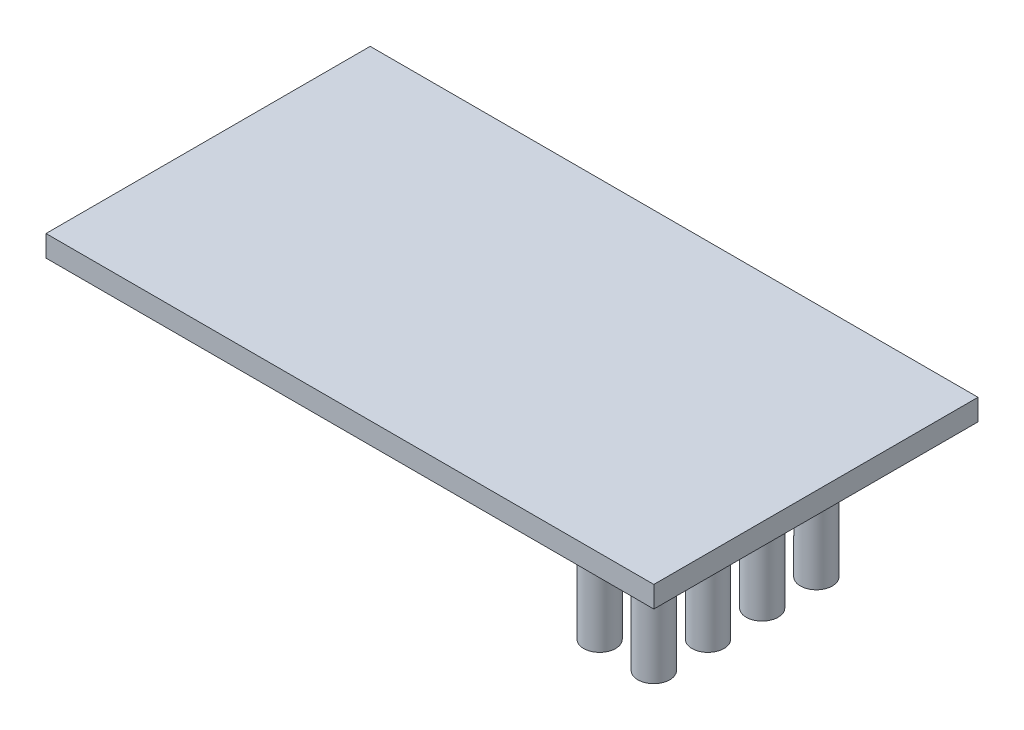
ISO-10303-21;
HEADER;
FILE_DESCRIPTION(('STEP AP214'),'2;1');
FILE_NAME('part.step','',(''),(''),'','','');
FILE_SCHEMA(('AUTOMOTIVE_DESIGN { 1 0 10303 214 1 1 1 1 }'));
ENDSEC;
DATA;
#1=APPLICATION_CONTEXT('core data for automotive mechanical design processes');
#2=APPLICATION_PROTOCOL_DEFINITION('international standard','automotive_design',2000,#1);
#3=PRODUCT_CONTEXT('',#1,'mechanical');
#4=PRODUCT('Part','Part','',(#3));
#5=PRODUCT_RELATED_PRODUCT_CATEGORY('part','',(#4));
#6=PRODUCT_DEFINITION_FORMATION('','',#4);
#7=PRODUCT_DEFINITION_CONTEXT('part definition',#1,'design');
#8=PRODUCT_DEFINITION('design','',#6,#7);
#9=PRODUCT_DEFINITION_SHAPE('','',#8);
#10=(LENGTH_UNIT() NAMED_UNIT(*) SI_UNIT(.MILLI.,.METRE.));
#11=(NAMED_UNIT(*) PLANE_ANGLE_UNIT() SI_UNIT($,.RADIAN.));
#12=(NAMED_UNIT(*) SI_UNIT($,.STERADIAN.) SOLID_ANGLE_UNIT());
#13=UNCERTAINTY_MEASURE_WITH_UNIT(LENGTH_MEASURE(1.E-05),#10,'distance_accuracy_value','');
#14=(GEOMETRIC_REPRESENTATION_CONTEXT(3) GLOBAL_UNCERTAINTY_ASSIGNED_CONTEXT((#13)) GLOBAL_UNIT_ASSIGNED_CONTEXT((#10,
#11,#12)) REPRESENTATION_CONTEXT('',''));
#15=CARTESIAN_POINT('',(0.,0.,0.));
#16=DIRECTION('',(0.,0.,1.));
#17=DIRECTION('',(1.,0.,0.));
#18=AXIS2_PLACEMENT_3D('',#15,#16,#17);
#19=CARTESIAN_POINT('',(28.5,1.,0.));
#20=DIRECTION('',(0.,0.,-1.));
#21=DIRECTION('',(-1.,0.,0.));
#22=AXIS2_PLACEMENT_3D('',#19,#20,#21);
#23=PLANE('',#22);
#24=DIRECTION('',(1.,0.,0.));
#25=VECTOR('',#24,1.);
#26=CARTESIAN_POINT('',(28.5,0.,0.));
#27=LINE('',#26,#25);
#28=CARTESIAN_POINT('',(0.,0.,0.));
#29=VERTEX_POINT('',#28);
#30=CARTESIAN_POINT('',(28.5,0.,0.));
#31=VERTEX_POINT('',#30);
#32=EDGE_CURVE('E111',#29,#31,#27,.T.);
#33=ORIENTED_EDGE('',*,*,#32,.T.);
#34=DIRECTION('',(0.,-1.,0.));
#35=VECTOR('',#34,1.);
#36=CARTESIAN_POINT('',(28.5,1.,0.));
#37=LINE('',#36,#35);
#38=CARTESIAN_POINT('',(28.5,1.,0.));
#39=VERTEX_POINT('',#38);
#40=EDGE_CURVE('E100',#39,#31,#37,.T.);
#41=ORIENTED_EDGE('',*,*,#40,.F.);
#42=DIRECTION('',(1.,0.,0.));
#43=VECTOR('',#42,1.);
#44=CARTESIAN_POINT('',(28.5,1.,0.));
#45=LINE('',#44,#43);
#46=CARTESIAN_POINT('',(0.,1.,0.));
#47=VERTEX_POINT('',#46);
#48=EDGE_CURVE('E92',#47,#39,#45,.T.);
#49=ORIENTED_EDGE('',*,*,#48,.F.);
#50=DIRECTION('',(0.,-1.,0.));
#51=VECTOR('',#50,1.);
#52=CARTESIAN_POINT('',(0.,1.,0.));
#53=LINE('',#52,#51);
#54=EDGE_CURVE('E107',#47,#29,#53,.T.);
#55=ORIENTED_EDGE('',*,*,#54,.T.);
#56=EDGE_LOOP('',(#33,#41,#49,#55));
#57=FACE_BOUND('',#56,.T.);
#58=ADVANCED_FACE('F39',(#57),#23,.F.);
#59=CARTESIAN_POINT('',(28.5,1.,-15.2));
#60=DIRECTION('',(-1.,0.,0.));
#61=DIRECTION('',(0.,0.,1.));
#62=AXIS2_PLACEMENT_3D('',#59,#60,#61);
#63=PLANE('',#62);
#64=DIRECTION('',(0.,0.,-1.));
#65=VECTOR('',#64,1.);
#66=CARTESIAN_POINT('',(28.5,0.,-15.2));
#67=LINE('',#66,#65);
#68=CARTESIAN_POINT('',(28.5,0.,-15.2));
#69=VERTEX_POINT('',#68);
#70=EDGE_CURVE('E98',#31,#69,#67,.T.);
#71=ORIENTED_EDGE('',*,*,#70,.T.);
#72=DIRECTION('',(0.,-1.,0.));
#73=VECTOR('',#72,1.);
#74=CARTESIAN_POINT('',(28.5,1.,-15.2));
#75=LINE('',#74,#73);
#76=CARTESIAN_POINT('',(28.5,1.,-15.2));
#77=VERTEX_POINT('',#76);
#78=EDGE_CURVE('E96',#77,#69,#75,.T.);
#79=ORIENTED_EDGE('',*,*,#78,.F.);
#80=DIRECTION('',(0.,0.,-1.));
#81=VECTOR('',#80,1.);
#82=CARTESIAN_POINT('',(28.5,1.,-15.2));
#83=LINE('',#82,#81);
#84=EDGE_CURVE('E87',#39,#77,#83,.T.);
#85=ORIENTED_EDGE('',*,*,#84,.F.);
#86=ORIENTED_EDGE('',*,*,#40,.T.);
#87=EDGE_LOOP('',(#71,#79,#85,#86));
#88=FACE_BOUND('',#87,.T.);
#89=ADVANCED_FACE('F97',(#88),#63,.F.);
#90=CARTESIAN_POINT('',(0.,1.,-15.2));
#91=DIRECTION('',(0.,0.,1.));
#92=DIRECTION('',(1.,0.,0.));
#93=AXIS2_PLACEMENT_3D('',#90,#91,#92);
#94=PLANE('',#93);
#95=DIRECTION('',(-1.,0.,0.));
#96=VECTOR('',#95,1.);
#97=CARTESIAN_POINT('',(0.,0.,-15.2));
#98=LINE('',#97,#96);
#99=CARTESIAN_POINT('',(0.,0.,-15.2));
#100=VERTEX_POINT('',#99);
#101=EDGE_CURVE('E73',#69,#100,#98,.T.);
#102=ORIENTED_EDGE('',*,*,#101,.T.);
#103=DIRECTION('',(0.,-1.,0.));
#104=VECTOR('',#103,1.);
#105=CARTESIAN_POINT('',(0.,1.,-15.2));
#106=LINE('',#105,#104);
#107=CARTESIAN_POINT('',(0.,1.,-15.2));
#108=VERTEX_POINT('',#107);
#109=EDGE_CURVE('E101',#108,#100,#106,.T.);
#110=ORIENTED_EDGE('',*,*,#109,.F.);
#111=DIRECTION('',(-1.,0.,0.));
#112=VECTOR('',#111,1.);
#113=CARTESIAN_POINT('',(0.,1.,-15.2));
#114=LINE('',#113,#112);
#115=EDGE_CURVE('E90',#77,#108,#114,.T.);
#116=ORIENTED_EDGE('',*,*,#115,.F.);
#117=ORIENTED_EDGE('',*,*,#78,.T.);
#118=EDGE_LOOP('',(#102,#110,#116,#117));
#119=FACE_BOUND('',#118,.T.);
#120=ADVANCED_FACE('F103',(#119),#94,.F.);
#121=CARTESIAN_POINT('',(0.,1.,0.));
#122=DIRECTION('',(1.,0.,0.));
#123=DIRECTION('',(0.,0.,-1.));
#124=AXIS2_PLACEMENT_3D('',#121,#122,#123);
#125=PLANE('',#124);
#126=DIRECTION('',(0.,0.,1.));
#127=VECTOR('',#126,1.);
#128=CARTESIAN_POINT('',(0.,0.,0.));
#129=LINE('',#128,#127);
#130=EDGE_CURVE('E79',#100,#29,#129,.T.);
#131=ORIENTED_EDGE('',*,*,#130,.T.);
#132=ORIENTED_EDGE('',*,*,#54,.F.);
#133=DIRECTION('',(0.,0.,1.));
#134=VECTOR('',#133,1.);
#135=CARTESIAN_POINT('',(0.,1.,0.));
#136=LINE('',#135,#134);
#137=EDGE_CURVE('E56',#108,#47,#136,.T.);
#138=ORIENTED_EDGE('',*,*,#137,.F.);
#139=ORIENTED_EDGE('',*,*,#109,.T.);
#140=EDGE_LOOP('',(#131,#132,#138,#139));
#141=FACE_BOUND('',#140,.T.);
#142=ADVANCED_FACE('F178',(#141),#125,.F.);
#143=CARTESIAN_POINT('',(0.,1.,0.));
#144=DIRECTION('',(0.,-1.,0.));
#145=DIRECTION('',(0.,0.,-1.));
#146=AXIS2_PLACEMENT_3D('',#143,#144,#145);
#147=PLANE('',#146);
#148=ORIENTED_EDGE('',*,*,#48,.T.);
#149=ORIENTED_EDGE('',*,*,#84,.T.);
#150=ORIENTED_EDGE('',*,*,#115,.T.);
#151=ORIENTED_EDGE('',*,*,#137,.T.);
#152=EDGE_LOOP('',(#148,#149,#150,#151));
#153=FACE_BOUND('',#152,.T.);
#154=ADVANCED_FACE('F88',(#153),#147,.F.);
#155=CARTESIAN_POINT('',(0.,0.,0.));
#156=DIRECTION('',(0.,-1.,0.));
#157=DIRECTION('',(0.,0.,-1.));
#158=AXIS2_PLACEMENT_3D('',#155,#156,#157);
#159=PLANE('',#158);
#160=CARTESIAN_POINT('',(26.9999999999999,0.,-1.5));
#161=DIRECTION('',(0.,-1.,0.));
#162=DIRECTION('',(0.,0.,-1.));
#163=AXIS2_PLACEMENT_3D('',#160,#161,#162);
#164=CIRCLE('',#163,0.750000000000002);
#165=CARTESIAN_POINT('',(26.9999999999999,0.,-2.25));
#166=VERTEX_POINT('',#165);
#167=EDGE_CURVE('E11',#166,#166,#164,.T.);
#168=ORIENTED_EDGE('',*,*,#167,.F.);
#169=EDGE_LOOP('',(#168));
#170=FACE_BOUND('',#169,.T.);
#171=CARTESIAN_POINT('',(24.4599999999999,0.,-1.5));
#172=DIRECTION('',(0.,-1.,0.));
#173=DIRECTION('',(0.,0.,-1.));
#174=AXIS2_PLACEMENT_3D('',#171,#172,#173);
#175=CIRCLE('',#174,0.750000000000002);
#176=CARTESIAN_POINT('',(24.4599999999999,0.,-2.25));
#177=VERTEX_POINT('',#176);
#178=EDGE_CURVE('E48',#177,#177,#175,.T.);
#179=ORIENTED_EDGE('',*,*,#178,.F.);
#180=EDGE_LOOP('',(#179));
#181=FACE_BOUND('',#180,.T.);
#182=CARTESIAN_POINT('',(26.9999999999999,0.,-4.04));
#183=DIRECTION('',(0.,-1.,0.));
#184=DIRECTION('',(0.,0.,-1.));
#185=AXIS2_PLACEMENT_3D('',#182,#183,#184);
#186=CIRCLE('',#185,0.750000000000002);
#187=CARTESIAN_POINT('',(26.9999999999999,0.,-4.79));
#188=VERTEX_POINT('',#187);
#189=EDGE_CURVE('E148',#188,#188,#186,.T.);
#190=ORIENTED_EDGE('',*,*,#189,.F.);
#191=EDGE_LOOP('',(#190));
#192=FACE_BOUND('',#191,.T.);
#193=CARTESIAN_POINT('',(24.4599999999999,0.,-4.04));
#194=DIRECTION('',(0.,-1.,0.));
#195=DIRECTION('',(0.,0.,-1.));
#196=AXIS2_PLACEMENT_3D('',#193,#194,#195);
#197=CIRCLE('',#196,0.750000000000002);
#198=CARTESIAN_POINT('',(24.4599999999999,0.,-4.79));
#199=VERTEX_POINT('',#198);
#200=EDGE_CURVE('E144',#199,#199,#197,.T.);
#201=ORIENTED_EDGE('',*,*,#200,.F.);
#202=EDGE_LOOP('',(#201));
#203=FACE_BOUND('',#202,.T.);
#204=CARTESIAN_POINT('',(24.4599999999999,0.,-6.58));
#205=DIRECTION('',(0.,-1.,0.));
#206=DIRECTION('',(0.,0.,-1.));
#207=AXIS2_PLACEMENT_3D('',#204,#205,#206);
#208=CIRCLE('',#207,0.750000000000002);
#209=CARTESIAN_POINT('',(24.4599999999999,0.,-7.33));
#210=VERTEX_POINT('',#209);
#211=EDGE_CURVE('E140',#210,#210,#208,.T.);
#212=ORIENTED_EDGE('',*,*,#211,.F.);
#213=EDGE_LOOP('',(#212));
#214=FACE_BOUND('',#213,.T.);
#215=CARTESIAN_POINT('',(27.,0.,-6.57999999999991));
#216=DIRECTION('',(0.,-1.,0.));
#217=DIRECTION('',(0.,0.,-1.));
#218=AXIS2_PLACEMENT_3D('',#215,#216,#217);
#219=CIRCLE('',#218,0.750000000000007);
#220=CARTESIAN_POINT('',(27.,0.,-7.32999999999991));
#221=VERTEX_POINT('',#220);
#222=EDGE_CURVE('E136',#221,#221,#219,.T.);
#223=ORIENTED_EDGE('',*,*,#222,.F.);
#224=EDGE_LOOP('',(#223));
#225=FACE_BOUND('',#224,.T.);
#226=CARTESIAN_POINT('',(27.,0.,-9.11999999999991));
#227=DIRECTION('',(0.,-1.,0.));
#228=DIRECTION('',(0.,0.,-1.));
#229=AXIS2_PLACEMENT_3D('',#226,#227,#228);
#230=CIRCLE('',#229,0.75);
#231=CARTESIAN_POINT('',(27.,0.,-9.86999999999991));
#232=VERTEX_POINT('',#231);
#233=EDGE_CURVE('E132',#232,#232,#230,.T.);
#234=ORIENTED_EDGE('',*,*,#233,.F.);
#235=EDGE_LOOP('',(#234));
#236=FACE_BOUND('',#235,.T.);
#237=CARTESIAN_POINT('',(24.4599999999999,0.,-9.12));
#238=DIRECTION('',(0.,-1.,0.));
#239=DIRECTION('',(0.,0.,-1.));
#240=AXIS2_PLACEMENT_3D('',#237,#238,#239);
#241=CIRCLE('',#240,0.750000000000002);
#242=CARTESIAN_POINT('',(24.4599999999999,0.,-9.87));
#243=VERTEX_POINT('',#242);
#244=EDGE_CURVE('E128',#243,#243,#241,.T.);
#245=ORIENTED_EDGE('',*,*,#244,.F.);
#246=EDGE_LOOP('',(#245));
#247=FACE_BOUND('',#246,.T.);
#248=ORIENTED_EDGE('',*,*,#32,.F.);
#249=ORIENTED_EDGE('',*,*,#130,.F.);
#250=ORIENTED_EDGE('',*,*,#101,.F.);
#251=ORIENTED_EDGE('',*,*,#70,.F.);
#252=EDGE_LOOP('',(#248,#249,#250,#251));
#253=FACE_BOUND('',#252,.T.);
#254=ADVANCED_FACE('F158',(#170,#181,#192,#203,#214,#225,#236,#247,#253),#159,.T.);
#255=CARTESIAN_POINT('',(24.4599999999999,-4.,-9.12));
#256=DIRECTION('',(0.,1.,0.));
#257=DIRECTION('',(0.,0.,1.));
#258=AXIS2_PLACEMENT_3D('',#255,#256,#257);
#259=CYLINDRICAL_SURFACE('',#258,0.750000000000002);
#260=ORIENTED_EDGE('',*,*,#244,.T.);
#261=EDGE_LOOP('',(#260));
#262=FACE_BOUND('',#261,.T.);
#263=CARTESIAN_POINT('',(24.4599999999999,-4.,-9.12));
#264=DIRECTION('',(0.,1.,0.));
#265=DIRECTION('',(0.,0.,1.));
#266=AXIS2_PLACEMENT_3D('',#263,#264,#265);
#267=CIRCLE('',#266,0.750000000000002);
#268=CARTESIAN_POINT('',(24.4599999999999,-4.,-8.37));
#269=VERTEX_POINT('',#268);
#270=EDGE_CURVE('E115',#269,#269,#267,.T.);
#271=ORIENTED_EDGE('',*,*,#270,.T.);
#272=EDGE_LOOP('',(#271));
#273=FACE_BOUND('',#272,.T.);
#274=ADVANCED_FACE('F161',(#262,#273),#259,.T.);
#275=CARTESIAN_POINT('',(24.4599999999999,-4.,-9.12));
#276=DIRECTION('',(0.,1.,0.));
#277=DIRECTION('',(0.,0.,1.));
#278=AXIS2_PLACEMENT_3D('',#275,#276,#277);
#279=PLANE('',#278);
#280=ORIENTED_EDGE('',*,*,#270,.F.);
#281=EDGE_LOOP('',(#280));
#282=FACE_BOUND('',#281,.T.);
#283=ADVANCED_FACE('F222',(#282),#279,.F.);
#284=CARTESIAN_POINT('',(27.,-4.,-9.11999999999991));
#285=DIRECTION('',(0.,1.,0.));
#286=DIRECTION('',(0.,0.,1.));
#287=AXIS2_PLACEMENT_3D('',#284,#285,#286);
#288=CYLINDRICAL_SURFACE('',#287,0.75);
#289=ORIENTED_EDGE('',*,*,#233,.T.);
#290=EDGE_LOOP('',(#289));
#291=FACE_BOUND('',#290,.T.);
#292=CARTESIAN_POINT('',(27.,-4.,-9.11999999999991));
#293=DIRECTION('',(0.,1.,0.));
#294=DIRECTION('',(0.,0.,1.));
#295=AXIS2_PLACEMENT_3D('',#292,#293,#294);
#296=CIRCLE('',#295,0.75);
#297=CARTESIAN_POINT('',(27.,-4.,-8.36999999999991));
#298=VERTEX_POINT('',#297);
#299=EDGE_CURVE('E401',#298,#298,#296,.T.);
#300=ORIENTED_EDGE('',*,*,#299,.T.);
#301=EDGE_LOOP('',(#300));
#302=FACE_BOUND('',#301,.T.);
#303=ADVANCED_FACE('F232',(#291,#302),#288,.T.);
#304=CARTESIAN_POINT('',(27.,-4.,-9.11999999999991));
#305=DIRECTION('',(0.,1.,0.));
#306=DIRECTION('',(0.,0.,1.));
#307=AXIS2_PLACEMENT_3D('',#304,#305,#306);
#308=PLANE('',#307);
#309=ORIENTED_EDGE('',*,*,#299,.F.);
#310=EDGE_LOOP('',(#309));
#311=FACE_BOUND('',#310,.T.);
#312=ADVANCED_FACE('F242',(#311),#308,.F.);
#313=CARTESIAN_POINT('',(27.,-4.,-6.57999999999991));
#314=DIRECTION('',(0.,1.,0.));
#315=DIRECTION('',(0.,0.,1.));
#316=AXIS2_PLACEMENT_3D('',#313,#314,#315);
#317=CYLINDRICAL_SURFACE('',#316,0.750000000000007);
#318=ORIENTED_EDGE('',*,*,#222,.T.);
#319=EDGE_LOOP('',(#318));
#320=FACE_BOUND('',#319,.T.);
#321=CARTESIAN_POINT('',(27.,-4.,-6.57999999999991));
#322=DIRECTION('',(0.,1.,0.));
#323=DIRECTION('',(0.,0.,1.));
#324=AXIS2_PLACEMENT_3D('',#321,#322,#323);
#325=CIRCLE('',#324,0.750000000000007);
#326=CARTESIAN_POINT('',(27.,-4.,-5.8299999999999));
#327=VERTEX_POINT('',#326);
#328=EDGE_CURVE('E397',#327,#327,#325,.T.);
#329=ORIENTED_EDGE('',*,*,#328,.T.);
#330=EDGE_LOOP('',(#329));
#331=FACE_BOUND('',#330,.T.);
#332=ADVANCED_FACE('F252',(#320,#331),#317,.T.);
#333=CARTESIAN_POINT('',(27.,-4.,-6.57999999999991));
#334=DIRECTION('',(0.,1.,0.));
#335=DIRECTION('',(0.,0.,1.));
#336=AXIS2_PLACEMENT_3D('',#333,#334,#335);
#337=PLANE('',#336);
#338=ORIENTED_EDGE('',*,*,#328,.F.);
#339=EDGE_LOOP('',(#338));
#340=FACE_BOUND('',#339,.T.);
#341=ADVANCED_FACE('F262',(#340),#337,.F.);
#342=CARTESIAN_POINT('',(24.4599999999999,-4.,-6.58));
#343=DIRECTION('',(0.,1.,0.));
#344=DIRECTION('',(0.,0.,1.));
#345=AXIS2_PLACEMENT_3D('',#342,#343,#344);
#346=CYLINDRICAL_SURFACE('',#345,0.750000000000002);
#347=ORIENTED_EDGE('',*,*,#211,.T.);
#348=EDGE_LOOP('',(#347));
#349=FACE_BOUND('',#348,.T.);
#350=CARTESIAN_POINT('',(24.4599999999999,-4.,-6.58));
#351=DIRECTION('',(0.,1.,0.));
#352=DIRECTION('',(0.,0.,1.));
#353=AXIS2_PLACEMENT_3D('',#350,#351,#352);
#354=CIRCLE('',#353,0.750000000000002);
#355=CARTESIAN_POINT('',(24.4599999999999,-4.,-5.83));
#356=VERTEX_POINT('',#355);
#357=EDGE_CURVE('E393',#356,#356,#354,.T.);
#358=ORIENTED_EDGE('',*,*,#357,.T.);
#359=EDGE_LOOP('',(#358));
#360=FACE_BOUND('',#359,.T.);
#361=ADVANCED_FACE('F272',(#349,#360),#346,.T.);
#362=CARTESIAN_POINT('',(24.4599999999999,-4.,-6.58));
#363=DIRECTION('',(0.,1.,0.));
#364=DIRECTION('',(0.,0.,1.));
#365=AXIS2_PLACEMENT_3D('',#362,#363,#364);
#366=PLANE('',#365);
#367=ORIENTED_EDGE('',*,*,#357,.F.);
#368=EDGE_LOOP('',(#367));
#369=FACE_BOUND('',#368,.T.);
#370=ADVANCED_FACE('F282',(#369),#366,.F.);
#371=CARTESIAN_POINT('',(24.4599999999999,-4.,-4.04));
#372=DIRECTION('',(0.,1.,0.));
#373=DIRECTION('',(0.,0.,1.));
#374=AXIS2_PLACEMENT_3D('',#371,#372,#373);
#375=CYLINDRICAL_SURFACE('',#374,0.750000000000002);
#376=ORIENTED_EDGE('',*,*,#200,.T.);
#377=EDGE_LOOP('',(#376));
#378=FACE_BOUND('',#377,.T.);
#379=CARTESIAN_POINT('',(24.4599999999999,-4.,-4.04));
#380=DIRECTION('',(0.,1.,0.));
#381=DIRECTION('',(0.,0.,1.));
#382=AXIS2_PLACEMENT_3D('',#379,#380,#381);
#383=CIRCLE('',#382,0.750000000000002);
#384=CARTESIAN_POINT('',(24.4599999999999,-4.,-3.29));
#385=VERTEX_POINT('',#384);
#386=EDGE_CURVE('E389',#385,#385,#383,.T.);
#387=ORIENTED_EDGE('',*,*,#386,.T.);
#388=EDGE_LOOP('',(#387));
#389=FACE_BOUND('',#388,.T.);
#390=ADVANCED_FACE('F292',(#378,#389),#375,.T.);
#391=CARTESIAN_POINT('',(24.4599999999999,-4.,-4.04));
#392=DIRECTION('',(0.,1.,0.));
#393=DIRECTION('',(0.,0.,1.));
#394=AXIS2_PLACEMENT_3D('',#391,#392,#393);
#395=PLANE('',#394);
#396=ORIENTED_EDGE('',*,*,#386,.F.);
#397=EDGE_LOOP('',(#396));
#398=FACE_BOUND('',#397,.T.);
#399=ADVANCED_FACE('F302',(#398),#395,.F.);
#400=CARTESIAN_POINT('',(26.9999999999999,-4.,-4.04));
#401=DIRECTION('',(0.,1.,0.));
#402=DIRECTION('',(0.,0.,1.));
#403=AXIS2_PLACEMENT_3D('',#400,#401,#402);
#404=CYLINDRICAL_SURFACE('',#403,0.750000000000002);
#405=ORIENTED_EDGE('',*,*,#189,.T.);
#406=EDGE_LOOP('',(#405));
#407=FACE_BOUND('',#406,.T.);
#408=CARTESIAN_POINT('',(26.9999999999999,-4.,-4.04));
#409=DIRECTION('',(0.,1.,0.));
#410=DIRECTION('',(0.,0.,1.));
#411=AXIS2_PLACEMENT_3D('',#408,#409,#410);
#412=CIRCLE('',#411,0.750000000000002);
#413=CARTESIAN_POINT('',(26.9999999999999,-4.,-3.29));
#414=VERTEX_POINT('',#413);
#415=EDGE_CURVE('E383',#414,#414,#412,.T.);
#416=ORIENTED_EDGE('',*,*,#415,.T.);
#417=EDGE_LOOP('',(#416));
#418=FACE_BOUND('',#417,.T.);
#419=ADVANCED_FACE('F312',(#407,#418),#404,.T.);
#420=CARTESIAN_POINT('',(26.9999999999999,-4.,-4.04));
#421=DIRECTION('',(0.,1.,0.));
#422=DIRECTION('',(0.,0.,1.));
#423=AXIS2_PLACEMENT_3D('',#420,#421,#422);
#424=PLANE('',#423);
#425=ORIENTED_EDGE('',*,*,#415,.F.);
#426=EDGE_LOOP('',(#425));
#427=FACE_BOUND('',#426,.T.);
#428=ADVANCED_FACE('F322',(#427),#424,.F.);
#429=CARTESIAN_POINT('',(24.4599999999999,-4.,-1.5));
#430=DIRECTION('',(0.,1.,0.));
#431=DIRECTION('',(0.,0.,1.));
#432=AXIS2_PLACEMENT_3D('',#429,#430,#431);
#433=CYLINDRICAL_SURFACE('',#432,0.750000000000002);
#434=ORIENTED_EDGE('',*,*,#178,.T.);
#435=EDGE_LOOP('',(#434));
#436=FACE_BOUND('',#435,.T.);
#437=CARTESIAN_POINT('',(24.4599999999999,-4.,-1.5));
#438=DIRECTION('',(0.,1.,0.));
#439=DIRECTION('',(0.,0.,1.));
#440=AXIS2_PLACEMENT_3D('',#437,#438,#439);
#441=CIRCLE('',#440,0.750000000000002);
#442=CARTESIAN_POINT('',(24.4599999999999,-4.,-0.749999999999998));
#443=VERTEX_POINT('',#442);
#444=EDGE_CURVE('E379',#443,#443,#441,.T.);
#445=ORIENTED_EDGE('',*,*,#444,.T.);
#446=EDGE_LOOP('',(#445));
#447=FACE_BOUND('',#446,.T.);
#448=ADVANCED_FACE('F155',(#436,#447),#433,.T.);
#449=CARTESIAN_POINT('',(24.4599999999999,-4.,-1.5));
#450=DIRECTION('',(0.,1.,0.));
#451=DIRECTION('',(0.,0.,1.));
#452=AXIS2_PLACEMENT_3D('',#449,#450,#451);
#453=PLANE('',#452);
#454=ORIENTED_EDGE('',*,*,#444,.F.);
#455=EDGE_LOOP('',(#454));
#456=FACE_BOUND('',#455,.T.);
#457=ADVANCED_FACE('F341',(#456),#453,.F.);
#458=CARTESIAN_POINT('',(26.9999999999999,-4.,-1.5));
#459=DIRECTION('',(0.,1.,0.));
#460=DIRECTION('',(0.,0.,1.));
#461=AXIS2_PLACEMENT_3D('',#458,#459,#460);
#462=CYLINDRICAL_SURFACE('',#461,0.750000000000002);
#463=ORIENTED_EDGE('',*,*,#167,.T.);
#464=EDGE_LOOP('',(#463));
#465=FACE_BOUND('',#464,.T.);
#466=CARTESIAN_POINT('',(26.9999999999999,-4.,-1.5));
#467=DIRECTION('',(0.,1.,0.));
#468=DIRECTION('',(0.,0.,1.));
#469=AXIS2_PLACEMENT_3D('',#466,#467,#468);
#470=CIRCLE('',#469,0.750000000000002);
#471=CARTESIAN_POINT('',(26.9999999999999,-4.,-0.749999999999998));
#472=VERTEX_POINT('',#471);
#473=EDGE_CURVE('E376',#472,#472,#470,.T.);
#474=ORIENTED_EDGE('',*,*,#473,.T.);
#475=EDGE_LOOP('',(#474));
#476=FACE_BOUND('',#475,.T.);
#477=ADVANCED_FACE('F350',(#465,#476),#462,.T.);
#478=CARTESIAN_POINT('',(26.9999999999999,-4.,-1.5));
#479=DIRECTION('',(0.,1.,0.));
#480=DIRECTION('',(0.,0.,1.));
#481=AXIS2_PLACEMENT_3D('',#478,#479,#480);
#482=PLANE('',#481);
#483=ORIENTED_EDGE('',*,*,#473,.F.);
#484=EDGE_LOOP('',(#483));
#485=FACE_BOUND('',#484,.T.);
#486=ADVANCED_FACE('F360',(#485),#482,.F.);
#487=CLOSED_SHELL('',(#58,#89,#120,#142,#154,#254,#274,#283,#303,#312,#332,#341,#361,#370,#390,
#399,#419,#428,#448,#457,#477,#486));
#488=MANIFOLD_SOLID_BREP('B2',#487);
#489=ADVANCED_BREP_SHAPE_REPRESENTATION('',(#18,#488),#14);
#490=SHAPE_DEFINITION_REPRESENTATION(#9,#489);
ENDSEC;
END-ISO-10303-21;
